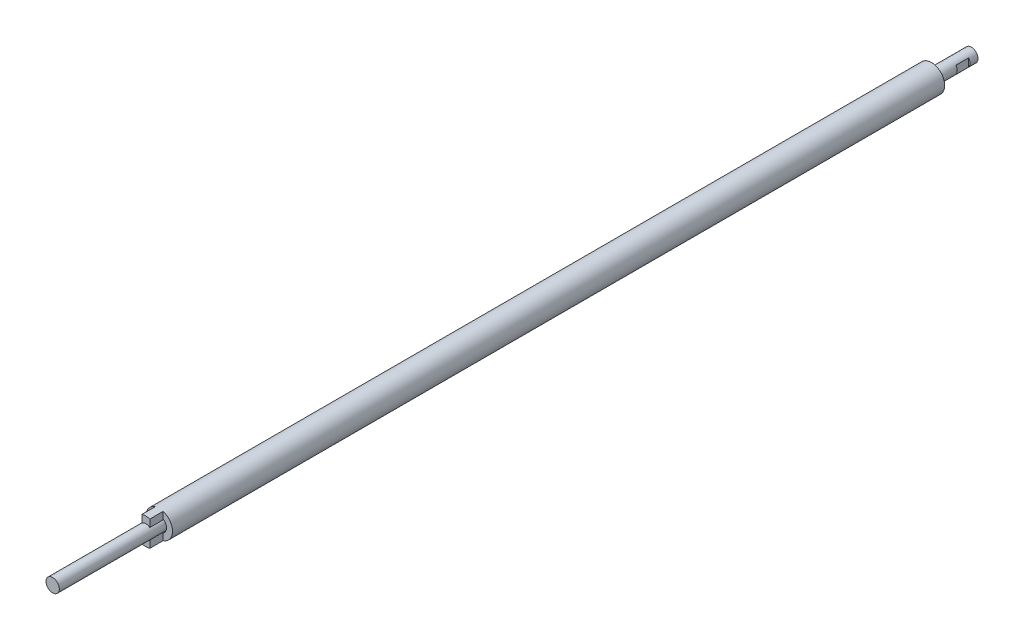
ISO-10303-21;
HEADER;
FILE_DESCRIPTION(('STEP AP214'),'2;1');
FILE_NAME('part.step','',(''),(''),'','','');
FILE_SCHEMA(('AUTOMOTIVE_DESIGN { 1 0 10303 214 1 1 1 1 }'));
ENDSEC;
DATA;
#1=APPLICATION_CONTEXT('core data for automotive mechanical design processes');
#2=APPLICATION_PROTOCOL_DEFINITION('international standard','automotive_design',2000,#1);
#3=PRODUCT_CONTEXT('',#1,'mechanical');
#4=PRODUCT('Part','Part','',(#3));
#5=PRODUCT_RELATED_PRODUCT_CATEGORY('part','',(#4));
#6=PRODUCT_DEFINITION_FORMATION('','',#4);
#7=PRODUCT_DEFINITION_CONTEXT('part definition',#1,'design');
#8=PRODUCT_DEFINITION('design','',#6,#7);
#9=PRODUCT_DEFINITION_SHAPE('','',#8);
#10=(LENGTH_UNIT() NAMED_UNIT(*) SI_UNIT(.MILLI.,.METRE.));
#11=(NAMED_UNIT(*) PLANE_ANGLE_UNIT() SI_UNIT($,.RADIAN.));
#12=(NAMED_UNIT(*) SI_UNIT($,.STERADIAN.) SOLID_ANGLE_UNIT());
#13=UNCERTAINTY_MEASURE_WITH_UNIT(LENGTH_MEASURE(1.E-05),#10,'distance_accuracy_value','');
#14=(GEOMETRIC_REPRESENTATION_CONTEXT(3) GLOBAL_UNCERTAINTY_ASSIGNED_CONTEXT((#13)) GLOBAL_UNIT_ASSIGNED_CONTEXT((#10,
#11,#12)) REPRESENTATION_CONTEXT('',''));
#15=CARTESIAN_POINT('',(0.,0.,0.));
#16=DIRECTION('',(0.,0.,1.));
#17=DIRECTION('',(1.,0.,0.));
#18=AXIS2_PLACEMENT_3D('',#15,#16,#17);
#19=CARTESIAN_POINT('',(0.,0.,305.));
#20=DIRECTION('',(0.,0.,1.));
#21=DIRECTION('',(1.,0.,0.));
#22=AXIS2_PLACEMENT_3D('',#19,#20,#21);
#23=PLANE('',#22);
#24=CARTESIAN_POINT('',(0.,0.,305.));
#25=DIRECTION('',(0.,0.,1.));
#26=DIRECTION('',(1.,0.,0.));
#27=AXIS2_PLACEMENT_3D('',#24,#25,#26);
#28=CIRCLE('',#27,2.5);
#29=CARTESIAN_POINT('',(1.5,2.,305.));
#30=VERTEX_POINT('',#29);
#31=CARTESIAN_POINT('',(-1.5,2.,305.));
#32=VERTEX_POINT('',#31);
#33=EDGE_CURVE('E225',#30,#32,#28,.T.);
#34=ORIENTED_EDGE('',*,*,#33,.T.);
#35=DIRECTION('',(0.,1.,0.));
#36=VECTOR('',#35,1.);
#37=CARTESIAN_POINT('',(-1.5,4.76969600708473,305.));
#38=LINE('',#37,#36);
#39=CARTESIAN_POINT('',(-1.5,2.30488611432322,305.));
#40=VERTEX_POINT('',#39);
#41=EDGE_CURVE('E159',#32,#40,#38,.T.);
#42=ORIENTED_EDGE('',*,*,#41,.T.);
#43=CARTESIAN_POINT('',(0.,0.,305.));
#44=DIRECTION('',(0.,0.,1.));
#45=DIRECTION('',(1.,0.,0.));
#46=AXIS2_PLACEMENT_3D('',#43,#44,#45);
#47=CIRCLE('',#46,2.75);
#48=CARTESIAN_POINT('',(1.5,2.30488611432322,305.));
#49=VERTEX_POINT('',#48);
#50=EDGE_CURVE('E11',#49,#40,#47,.T.);
#51=ORIENTED_EDGE('',*,*,#50,.F.);
#52=DIRECTION('',(0.,-1.,0.));
#53=VECTOR('',#52,1.);
#54=CARTESIAN_POINT('',(1.5,4.76969600708473,305.));
#55=LINE('',#54,#53);
#56=EDGE_CURVE('E184',#49,#30,#55,.T.);
#57=ORIENTED_EDGE('',*,*,#56,.T.);
#58=EDGE_LOOP('',(#34,#42,#51,#57));
#59=FACE_BOUND('',#58,.T.);
#60=ADVANCED_FACE('F45',(#59),#23,.F.);
#61=CARTESIAN_POINT('',(0.,0.,310.));
#62=DIRECTION('',(0.,0.,1.));
#63=DIRECTION('',(1.,0.,0.));
#64=AXIS2_PLACEMENT_3D('',#61,#62,#63);
#65=PLANE('',#64);
#66=DIRECTION('',(0.,1.,0.));
#67=VECTOR('',#66,1.);
#68=CARTESIAN_POINT('',(-1.5,4.76969600708473,310.));
#69=LINE('',#68,#67);
#70=CARTESIAN_POINT('',(-1.5,2.,310.));
#71=VERTEX_POINT('',#70);
#72=CARTESIAN_POINT('',(-1.5,4.76969600708473,310.));
#73=VERTEX_POINT('',#72);
#74=EDGE_CURVE('E151',#71,#73,#69,.T.);
#75=ORIENTED_EDGE('',*,*,#74,.F.);
#76=CARTESIAN_POINT('',(0.,0.,310.));
#77=DIRECTION('',(0.,0.,1.));
#78=DIRECTION('',(1.,0.,0.));
#79=AXIS2_PLACEMENT_3D('',#76,#77,#78);
#80=CIRCLE('',#79,2.5);
#81=CARTESIAN_POINT('',(1.5,2.,310.));
#82=VERTEX_POINT('',#81);
#83=EDGE_CURVE('E211',#82,#71,#80,.T.);
#84=ORIENTED_EDGE('',*,*,#83,.F.);
#85=DIRECTION('',(0.,-1.,0.));
#86=VECTOR('',#85,1.);
#87=CARTESIAN_POINT('',(1.5,4.76969600708473,310.));
#88=LINE('',#87,#86);
#89=CARTESIAN_POINT('',(1.5,4.76969600708473,310.));
#90=VERTEX_POINT('',#89);
#91=EDGE_CURVE('E177',#90,#82,#88,.T.);
#92=ORIENTED_EDGE('',*,*,#91,.F.);
#93=CARTESIAN_POINT('',(0.,0.,310.));
#94=DIRECTION('',(0.,0.,1.));
#95=DIRECTION('',(1.,0.,0.));
#96=AXIS2_PLACEMENT_3D('',#93,#94,#95);
#97=CIRCLE('',#96,5.);
#98=EDGE_CURVE('E197',#90,#73,#97,.T.);
#99=ORIENTED_EDGE('',*,*,#98,.T.);
#100=EDGE_LOOP('',(#75,#84,#92,#99));
#101=FACE_BOUND('',#100,.T.);
#102=ADVANCED_FACE('F266',(#101),#65,.T.);
#103=CARTESIAN_POINT('',(0.,0.,345.));
#104=DIRECTION('',(0.,0.,-1.));
#105=DIRECTION('',(-1.,0.,0.));
#106=AXIS2_PLACEMENT_3D('',#103,#104,#105);
#107=CYLINDRICAL_SURFACE('',#106,2.5);
#108=DIRECTION('',(0.,0.,1.));
#109=VECTOR('',#108,1.);
#110=CARTESIAN_POINT('',(-1.5,2.,305.));
#111=LINE('',#110,#109);
#112=EDGE_CURVE('E161',#32,#71,#111,.T.);
#113=ORIENTED_EDGE('',*,*,#112,.F.);
#114=ORIENTED_EDGE('',*,*,#33,.F.);
#115=DIRECTION('',(0.,0.,1.));
#116=VECTOR('',#115,1.);
#117=CARTESIAN_POINT('',(1.5,2.,305.));
#118=LINE('',#117,#116);
#119=EDGE_CURVE('E69',#30,#82,#118,.T.);
#120=ORIENTED_EDGE('',*,*,#119,.T.);
#121=ORIENTED_EDGE('',*,*,#83,.T.);
#122=EDGE_LOOP('',(#113,#114,#120,#121));
#123=FACE_BOUND('',#122,.T.);
#124=CARTESIAN_POINT('',(-1.5,-2.,305.));
#125=VERTEX_POINT('',#124);
#126=CARTESIAN_POINT('',(1.5,-2.,305.));
#127=VERTEX_POINT('',#126);
#128=EDGE_CURVE('E222',#125,#127,#28,.T.);
#129=ORIENTED_EDGE('',*,*,#128,.F.);
#130=DIRECTION('',(0.,0.,1.));
#131=VECTOR('',#130,1.);
#132=CARTESIAN_POINT('',(-1.5,-2.,305.));
#133=LINE('',#132,#131);
#134=CARTESIAN_POINT('',(-1.5,-2.,310.));
#135=VERTEX_POINT('',#134);
#136=EDGE_CURVE('E61',#125,#135,#133,.T.);
#137=ORIENTED_EDGE('',*,*,#136,.T.);
#138=CARTESIAN_POINT('',(1.5,-2.,310.));
#139=VERTEX_POINT('',#138);
#140=EDGE_CURVE('E200',#135,#139,#80,.T.);
#141=ORIENTED_EDGE('',*,*,#140,.T.);
#142=DIRECTION('',(0.,0.,1.));
#143=VECTOR('',#142,1.);
#144=CARTESIAN_POINT('',(1.5,-2.,305.));
#145=LINE('',#144,#143);
#146=EDGE_CURVE('E171',#127,#139,#145,.T.);
#147=ORIENTED_EDGE('',*,*,#146,.F.);
#148=EDGE_LOOP('',(#129,#137,#141,#147));
#149=FACE_BOUND('',#148,.T.);
#150=CARTESIAN_POINT('',(0.,0.,345.));
#151=DIRECTION('',(0.,0.,1.));
#152=DIRECTION('',(1.,0.,0.));
#153=AXIS2_PLACEMENT_3D('',#150,#151,#152);
#154=CIRCLE('',#153,2.5);
#155=CARTESIAN_POINT('',(2.5,0.,345.));
#156=VERTEX_POINT('',#155);
#157=EDGE_CURVE('E219',#156,#156,#154,.T.);
#158=ORIENTED_EDGE('',*,*,#157,.F.);
#159=EDGE_LOOP('',(#158));
#160=FACE_BOUND('',#159,.T.);
#161=CARTESIAN_POINT('',(0.,0.,7.8));
#162=DIRECTION('',(0.,0.,-1.));
#163=DIRECTION('',(-1.,0.,0.));
#164=AXIS2_PLACEMENT_3D('',#161,#162,#163);
#165=CIRCLE('',#164,2.5);
#166=CARTESIAN_POINT('',(2.,1.5,7.8));
#167=VERTEX_POINT('',#166);
#168=CARTESIAN_POINT('',(2.,-1.5,7.8));
#169=VERTEX_POINT('',#168);
#170=EDGE_CURVE('E201',#167,#169,#165,.T.);
#171=ORIENTED_EDGE('',*,*,#170,.F.);
#172=DIRECTION('',(0.,0.,-1.));
#173=VECTOR('',#172,1.);
#174=CARTESIAN_POINT('',(2.,1.5,7.8));
#175=LINE('',#174,#173);
#176=CARTESIAN_POINT('',(2.,1.5,3.));
#177=VERTEX_POINT('',#176);
#178=EDGE_CURVE('E213',#167,#177,#175,.T.);
#179=ORIENTED_EDGE('',*,*,#178,.T.);
#180=CARTESIAN_POINT('',(0.,0.,3.));
#181=DIRECTION('',(0.,0.,-1.));
#182=DIRECTION('',(-1.,0.,0.));
#183=AXIS2_PLACEMENT_3D('',#180,#181,#182);
#184=CIRCLE('',#183,2.5);
#185=CARTESIAN_POINT('',(2.,-1.5,3.));
#186=VERTEX_POINT('',#185);
#187=EDGE_CURVE('E208',#177,#186,#184,.T.);
#188=ORIENTED_EDGE('',*,*,#187,.T.);
#189=DIRECTION('',(0.,0.,-1.));
#190=VECTOR('',#189,1.);
#191=CARTESIAN_POINT('',(2.,-1.5,7.8));
#192=LINE('',#191,#190);
#193=EDGE_CURVE('E207',#169,#186,#192,.T.);
#194=ORIENTED_EDGE('',*,*,#193,.F.);
#195=EDGE_LOOP('',(#171,#179,#188,#194));
#196=FACE_BOUND('',#195,.T.);
#197=CARTESIAN_POINT('',(0.,0.,0.));
#198=DIRECTION('',(0.,0.,1.));
#199=DIRECTION('',(1.,0.,0.));
#200=AXIS2_PLACEMENT_3D('',#197,#198,#199);
#201=CIRCLE('',#200,2.5);
#202=CARTESIAN_POINT('',(2.5,0.,0.));
#203=VERTEX_POINT('',#202);
#204=EDGE_CURVE('E216',#203,#203,#201,.T.);
#205=ORIENTED_EDGE('',*,*,#204,.T.);
#206=EDGE_LOOP('',(#205));
#207=FACE_BOUND('',#206,.T.);
#208=ADVANCED_FACE('F47',(#123,#149,#160,#196,#207),#107,.T.);
#209=CARTESIAN_POINT('',(0.,0.,345.));
#210=DIRECTION('',(0.,0.,1.));
#211=DIRECTION('',(1.,0.,0.));
#212=AXIS2_PLACEMENT_3D('',#209,#210,#211);
#213=PLANE('',#212);
#214=ORIENTED_EDGE('',*,*,#157,.T.);
#215=EDGE_LOOP('',(#214));
#216=FACE_BOUND('',#215,.T.);
#217=ADVANCED_FACE('F272',(#216),#213,.T.);
#218=CARTESIAN_POINT('',(0.,0.,310.));
#219=DIRECTION('',(0.,0.,-1.));
#220=DIRECTION('',(-1.,0.,0.));
#221=AXIS2_PLACEMENT_3D('',#218,#219,#220);
#222=CYLINDRICAL_SURFACE('',#221,5.);
#223=CARTESIAN_POINT('',(0.,0.,305.));
#224=DIRECTION('',(0.,0.,1.));
#225=DIRECTION('',(1.,0.,0.));
#226=AXIS2_PLACEMENT_3D('',#223,#224,#225);
#227=CIRCLE('',#226,5.);
#228=CARTESIAN_POINT('',(-1.5,4.76969600708473,305.));
#229=VERTEX_POINT('',#228);
#230=CARTESIAN_POINT('',(-1.5,-4.76969600708473,305.));
#231=VERTEX_POINT('',#230);
#232=EDGE_CURVE('E145',#229,#231,#227,.T.);
#233=ORIENTED_EDGE('',*,*,#232,.F.);
#234=DIRECTION('',(0.,0.,1.));
#235=VECTOR('',#234,1.);
#236=CARTESIAN_POINT('',(-1.5,4.76969600708473,305.));
#237=LINE('',#236,#235);
#238=EDGE_CURVE('E257',#229,#73,#237,.T.);
#239=ORIENTED_EDGE('',*,*,#238,.T.);
#240=ORIENTED_EDGE('',*,*,#98,.F.);
#241=DIRECTION('',(0.,0.,1.));
#242=VECTOR('',#241,1.);
#243=CARTESIAN_POINT('',(1.5,4.76969600708473,305.));
#244=LINE('',#243,#242);
#245=CARTESIAN_POINT('',(1.5,4.76969600708473,305.));
#246=VERTEX_POINT('',#245);
#247=EDGE_CURVE('E167',#246,#90,#244,.T.);
#248=ORIENTED_EDGE('',*,*,#247,.F.);
#249=CARTESIAN_POINT('',(0.,0.,305.));
#250=DIRECTION('',(0.,0.,1.));
#251=DIRECTION('',(1.,0.,0.));
#252=AXIS2_PLACEMENT_3D('',#249,#250,#251);
#253=CIRCLE('',#252,5.);
#254=CARTESIAN_POINT('',(1.5,-4.76969600708473,305.));
#255=VERTEX_POINT('',#254);
#256=EDGE_CURVE('E178',#255,#246,#253,.T.);
#257=ORIENTED_EDGE('',*,*,#256,.F.);
#258=DIRECTION('',(0.,0.,1.));
#259=VECTOR('',#258,1.);
#260=CARTESIAN_POINT('',(1.5,-4.76969600708473,305.));
#261=LINE('',#260,#259);
#262=CARTESIAN_POINT('',(1.5,-4.76969600708473,310.));
#263=VERTEX_POINT('',#262);
#264=EDGE_CURVE('E173',#255,#263,#261,.T.);
#265=ORIENTED_EDGE('',*,*,#264,.T.);
#266=CARTESIAN_POINT('',(-1.5,-4.76969600708473,310.));
#267=VERTEX_POINT('',#266);
#268=EDGE_CURVE('E158',#267,#263,#97,.T.);
#269=ORIENTED_EDGE('',*,*,#268,.F.);
#270=DIRECTION('',(0.,0.,1.));
#271=VECTOR('',#270,1.);
#272=CARTESIAN_POINT('',(-1.5,-4.76969600708473,305.));
#273=LINE('',#272,#271);
#274=EDGE_CURVE('E137',#231,#267,#273,.T.);
#275=ORIENTED_EDGE('',*,*,#274,.F.);
#276=EDGE_LOOP('',(#233,#239,#240,#248,#257,#265,#269,#275));
#277=FACE_BOUND('',#276,.T.);
#278=CARTESIAN_POINT('',(0.,0.,15.));
#279=DIRECTION('',(0.,0.,1.));
#280=DIRECTION('',(1.,0.,0.));
#281=AXIS2_PLACEMENT_3D('',#278,#279,#280);
#282=CIRCLE('',#281,5.);
#283=CARTESIAN_POINT('',(5.,0.,15.));
#284=VERTEX_POINT('',#283);
#285=EDGE_CURVE('E193',#284,#284,#282,.T.);
#286=ORIENTED_EDGE('',*,*,#285,.T.);
#287=EDGE_LOOP('',(#286));
#288=FACE_BOUND('',#287,.T.);
#289=ADVANCED_FACE('F154',(#277,#288),#222,.T.);
#290=DIRECTION('',(0.,1.,0.));
#291=VECTOR('',#290,1.);
#292=CARTESIAN_POINT('',(-1.5,-2.,310.));
#293=LINE('',#292,#291);
#294=EDGE_CURVE('E180',#267,#135,#293,.T.);
#295=ORIENTED_EDGE('',*,*,#294,.F.);
#296=ORIENTED_EDGE('',*,*,#268,.T.);
#297=DIRECTION('',(0.,-1.,0.));
#298=VECTOR('',#297,1.);
#299=CARTESIAN_POINT('',(1.5,-2.,310.));
#300=LINE('',#299,#298);
#301=EDGE_CURVE('E175',#139,#263,#300,.T.);
#302=ORIENTED_EDGE('',*,*,#301,.F.);
#303=ORIENTED_EDGE('',*,*,#140,.F.);
#304=EDGE_LOOP('',(#295,#296,#302,#303));
#305=FACE_BOUND('',#304,.T.);
#306=ADVANCED_FACE('F238',(#305),#65,.T.);
#307=CARTESIAN_POINT('',(0.,0.,15.));
#308=DIRECTION('',(0.,0.,1.));
#309=DIRECTION('',(1.,0.,0.));
#310=AXIS2_PLACEMENT_3D('',#307,#308,#309);
#311=PLANE('',#310);
#312=CARTESIAN_POINT('',(0.,0.,15.));
#313=DIRECTION('',(0.,0.,1.));
#314=DIRECTION('',(1.,0.,0.));
#315=AXIS2_PLACEMENT_3D('',#312,#313,#314);
#316=CIRCLE('',#315,2.75);
#317=CARTESIAN_POINT('',(2.75,0.,15.));
#318=VERTEX_POINT('',#317);
#319=EDGE_CURVE('E190',#318,#318,#316,.T.);
#320=ORIENTED_EDGE('',*,*,#319,.T.);
#321=EDGE_LOOP('',(#320));
#322=FACE_BOUND('',#321,.T.);
#323=ORIENTED_EDGE('',*,*,#285,.F.);
#324=EDGE_LOOP('',(#323));
#325=FACE_BOUND('',#324,.T.);
#326=ADVANCED_FACE('F310',(#322,#325),#311,.F.);
#327=CARTESIAN_POINT('',(0.,0.,15.));
#328=DIRECTION('',(0.,0.,1.));
#329=DIRECTION('',(1.,0.,0.));
#330=AXIS2_PLACEMENT_3D('',#327,#328,#329);
#331=CYLINDRICAL_SURFACE('',#330,2.75);
#332=ORIENTED_EDGE('',*,*,#319,.F.);
#333=EDGE_LOOP('',(#332));
#334=FACE_BOUND('',#333,.T.);
#335=ORIENTED_EDGE('',*,*,#50,.T.);
#336=CARTESIAN_POINT('',(-1.5,-2.30488611432322,305.));
#337=VERTEX_POINT('',#336);
#338=EDGE_CURVE('E194',#40,#337,#47,.T.);
#339=ORIENTED_EDGE('',*,*,#338,.T.);
#340=CARTESIAN_POINT('',(1.5,-2.30488611432322,305.));
#341=VERTEX_POINT('',#340);
#342=EDGE_CURVE('E53',#337,#341,#47,.T.);
#343=ORIENTED_EDGE('',*,*,#342,.T.);
#344=EDGE_CURVE('E54',#341,#49,#47,.T.);
#345=ORIENTED_EDGE('',*,*,#344,.T.);
#346=EDGE_LOOP('',(#335,#339,#343,#345));
#347=FACE_BOUND('',#346,.T.);
#348=ADVANCED_FACE('F255',(#334,#347),#331,.F.);
#349=CARTESIAN_POINT('',(0.,0.,0.));
#350=DIRECTION('',(0.,0.,1.));
#351=DIRECTION('',(1.,0.,0.));
#352=AXIS2_PLACEMENT_3D('',#349,#350,#351);
#353=PLANE('',#352);
#354=ORIENTED_EDGE('',*,*,#204,.F.);
#355=EDGE_LOOP('',(#354));
#356=FACE_BOUND('',#355,.T.);
#357=ADVANCED_FACE('F303',(#356),#353,.F.);
#358=CARTESIAN_POINT('',(0.,0.,3.));
#359=DIRECTION('',(0.,0.,-1.));
#360=DIRECTION('',(-1.,0.,0.));
#361=AXIS2_PLACEMENT_3D('',#358,#359,#360);
#362=PLANE('',#361);
#363=ORIENTED_EDGE('',*,*,#187,.F.);
#364=DIRECTION('',(0.,-1.,0.));
#365=VECTOR('',#364,1.);
#366=CARTESIAN_POINT('',(2.,1.5,3.));
#367=LINE('',#366,#365);
#368=EDGE_CURVE('E205',#177,#186,#367,.T.);
#369=ORIENTED_EDGE('',*,*,#368,.T.);
#370=EDGE_LOOP('',(#363,#369));
#371=FACE_BOUND('',#370,.T.);
#372=ADVANCED_FACE('F298',(#371),#362,.F.);
#373=CARTESIAN_POINT('',(2.,1.5,7.8));
#374=DIRECTION('',(1.,0.,0.));
#375=DIRECTION('',(0.,0.,-1.));
#376=AXIS2_PLACEMENT_3D('',#373,#374,#375);
#377=PLANE('',#376);
#378=ORIENTED_EDGE('',*,*,#368,.F.);
#379=ORIENTED_EDGE('',*,*,#178,.F.);
#380=DIRECTION('',(0.,-1.,0.));
#381=VECTOR('',#380,1.);
#382=CARTESIAN_POINT('',(2.,1.5,7.8));
#383=LINE('',#382,#381);
#384=EDGE_CURVE('E204',#167,#169,#383,.T.);
#385=ORIENTED_EDGE('',*,*,#384,.T.);
#386=ORIENTED_EDGE('',*,*,#193,.T.);
#387=EDGE_LOOP('',(#378,#379,#385,#386));
#388=FACE_BOUND('',#387,.T.);
#389=ADVANCED_FACE('F292',(#388),#377,.T.);
#390=CARTESIAN_POINT('',(0.,0.,7.8));
#391=DIRECTION('',(0.,0.,-1.));
#392=DIRECTION('',(-1.,0.,0.));
#393=AXIS2_PLACEMENT_3D('',#390,#391,#392);
#394=PLANE('',#393);
#395=ORIENTED_EDGE('',*,*,#170,.T.);
#396=ORIENTED_EDGE('',*,*,#384,.F.);
#397=EDGE_LOOP('',(#395,#396));
#398=FACE_BOUND('',#397,.T.);
#399=ADVANCED_FACE('F286',(#398),#394,.T.);
#400=ORIENTED_EDGE('',*,*,#342,.F.);
#401=DIRECTION('',(0.,1.,0.));
#402=VECTOR('',#401,1.);
#403=CARTESIAN_POINT('',(-1.5,-2.,305.));
#404=LINE('',#403,#402);
#405=EDGE_CURVE('E139',#337,#125,#404,.T.);
#406=ORIENTED_EDGE('',*,*,#405,.T.);
#407=ORIENTED_EDGE('',*,*,#128,.T.);
#408=DIRECTION('',(0.,-1.,0.));
#409=VECTOR('',#408,1.);
#410=CARTESIAN_POINT('',(1.5,-2.,305.));
#411=LINE('',#410,#409);
#412=EDGE_CURVE('E181',#127,#341,#411,.T.);
#413=ORIENTED_EDGE('',*,*,#412,.T.);
#414=EDGE_LOOP('',(#400,#406,#407,#413));
#415=FACE_BOUND('',#414,.T.);
#416=ADVANCED_FACE('F252',(#415),#23,.F.);
#417=CARTESIAN_POINT('',(1.5,-2.,305.));
#418=DIRECTION('',(-1.,0.,0.));
#419=DIRECTION('',(0.,0.,1.));
#420=AXIS2_PLACEMENT_3D('',#417,#418,#419);
#421=PLANE('',#420);
#422=ORIENTED_EDGE('',*,*,#301,.T.);
#423=ORIENTED_EDGE('',*,*,#264,.F.);
#424=EDGE_CURVE('E169',#341,#255,#411,.T.);
#425=ORIENTED_EDGE('',*,*,#424,.F.);
#426=ORIENTED_EDGE('',*,*,#412,.F.);
#427=ORIENTED_EDGE('',*,*,#146,.T.);
#428=EDGE_LOOP('',(#422,#423,#425,#426,#427));
#429=FACE_BOUND('',#428,.T.);
#430=ADVANCED_FACE('F241',(#429),#421,.F.);
#431=CARTESIAN_POINT('',(1.5,4.76969600708473,305.));
#432=DIRECTION('',(-1.,0.,0.));
#433=DIRECTION('',(0.,0.,1.));
#434=AXIS2_PLACEMENT_3D('',#431,#432,#433);
#435=PLANE('',#434);
#436=ORIENTED_EDGE('',*,*,#91,.T.);
#437=ORIENTED_EDGE('',*,*,#119,.F.);
#438=ORIENTED_EDGE('',*,*,#56,.F.);
#439=EDGE_CURVE('E185',#246,#49,#55,.T.);
#440=ORIENTED_EDGE('',*,*,#439,.F.);
#441=ORIENTED_EDGE('',*,*,#247,.T.);
#442=EDGE_LOOP('',(#436,#437,#438,#440,#441));
#443=FACE_BOUND('',#442,.T.);
#444=ADVANCED_FACE('F268',(#443),#435,.F.);
#445=CARTESIAN_POINT('',(0.,0.,305.));
#446=DIRECTION('',(0.,0.,1.));
#447=DIRECTION('',(1.,0.,0.));
#448=AXIS2_PLACEMENT_3D('',#445,#446,#447);
#449=PLANE('',#448);
#450=ORIENTED_EDGE('',*,*,#424,.T.);
#451=ORIENTED_EDGE('',*,*,#256,.T.);
#452=ORIENTED_EDGE('',*,*,#439,.T.);
#453=ORIENTED_EDGE('',*,*,#344,.F.);
#454=EDGE_LOOP('',(#450,#451,#452,#453));
#455=FACE_BOUND('',#454,.T.);
#456=ADVANCED_FACE('F247',(#455),#449,.T.);
#457=CARTESIAN_POINT('',(-1.5,4.76969600708473,305.));
#458=DIRECTION('',(1.,0.,0.));
#459=DIRECTION('',(0.,0.,-1.));
#460=AXIS2_PLACEMENT_3D('',#457,#458,#459);
#461=PLANE('',#460);
#462=ORIENTED_EDGE('',*,*,#74,.T.);
#463=ORIENTED_EDGE('',*,*,#238,.F.);
#464=EDGE_CURVE('E142',#40,#229,#38,.T.);
#465=ORIENTED_EDGE('',*,*,#464,.F.);
#466=ORIENTED_EDGE('',*,*,#41,.F.);
#467=ORIENTED_EDGE('',*,*,#112,.T.);
#468=EDGE_LOOP('',(#462,#463,#465,#466,#467));
#469=FACE_BOUND('',#468,.T.);
#470=ADVANCED_FACE('F263',(#469),#461,.F.);
#471=CARTESIAN_POINT('',(-1.5,-2.,305.));
#472=DIRECTION('',(1.,0.,0.));
#473=DIRECTION('',(0.,0.,-1.));
#474=AXIS2_PLACEMENT_3D('',#471,#472,#473);
#475=PLANE('',#474);
#476=ORIENTED_EDGE('',*,*,#294,.T.);
#477=ORIENTED_EDGE('',*,*,#136,.F.);
#478=ORIENTED_EDGE('',*,*,#405,.F.);
#479=EDGE_CURVE('E133',#231,#337,#404,.T.);
#480=ORIENTED_EDGE('',*,*,#479,.F.);
#481=ORIENTED_EDGE('',*,*,#274,.T.);
#482=EDGE_LOOP('',(#476,#477,#478,#480,#481));
#483=FACE_BOUND('',#482,.T.);
#484=ADVANCED_FACE('F135',(#483),#475,.F.);
#485=CARTESIAN_POINT('',(0.,0.,305.));
#486=DIRECTION('',(0.,0.,1.));
#487=DIRECTION('',(1.,0.,0.));
#488=AXIS2_PLACEMENT_3D('',#485,#486,#487);
#489=PLANE('',#488);
#490=ORIENTED_EDGE('',*,*,#464,.T.);
#491=ORIENTED_EDGE('',*,*,#232,.T.);
#492=ORIENTED_EDGE('',*,*,#479,.T.);
#493=ORIENTED_EDGE('',*,*,#338,.F.);
#494=EDGE_LOOP('',(#490,#491,#492,#493));
#495=FACE_BOUND('',#494,.T.);
#496=ADVANCED_FACE('F146',(#495),#489,.T.);
#497=CLOSED_SHELL('',(#60,#102,#208,#217,#289,#306,#326,#348,#357,#372,#389,#399,#416,#430,#444,
#456,#470,#484,#496));
#498=MANIFOLD_SOLID_BREP('B2',#497);
#499=ADVANCED_BREP_SHAPE_REPRESENTATION('',(#18,#498),#14);
#500=SHAPE_DEFINITION_REPRESENTATION(#9,#499);
ENDSEC;
END-ISO-10303-21;
